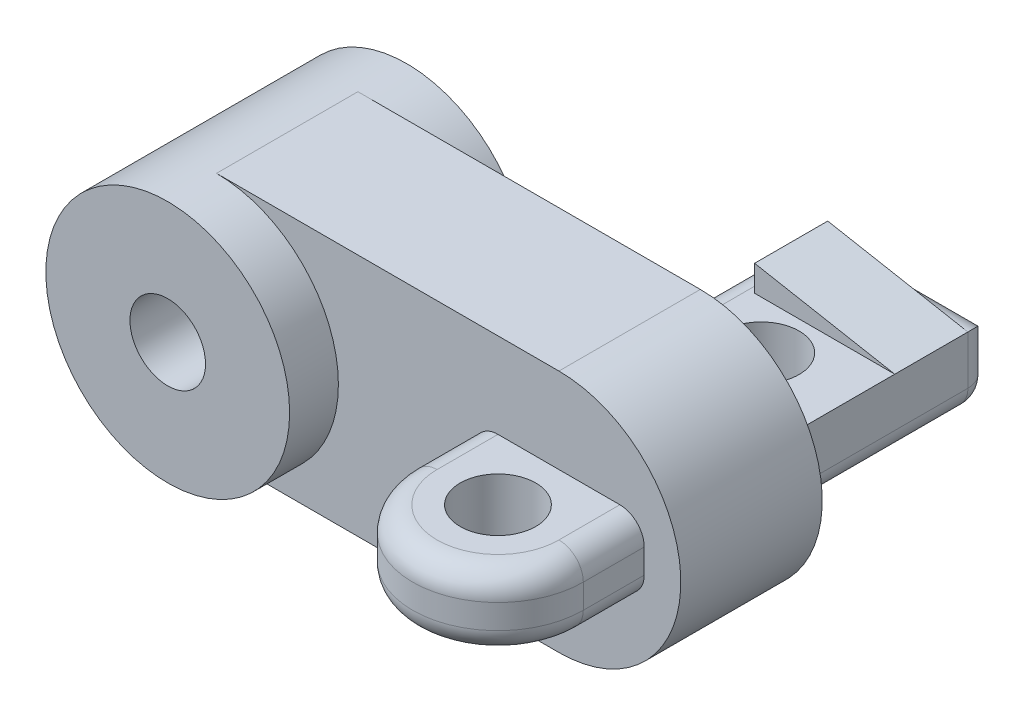
ISO-10303-21;
HEADER;
FILE_DESCRIPTION(('STEP AP214'),'2;1');
FILE_NAME('part.step','',(''),(''),'','','');
FILE_SCHEMA(('AUTOMOTIVE_DESIGN { 1 0 10303 214 1 1 1 1 }'));
ENDSEC;
DATA;
#1=APPLICATION_CONTEXT('core data for automotive mechanical design processes');
#2=APPLICATION_PROTOCOL_DEFINITION('international standard','automotive_design',2000,#1);
#3=PRODUCT_CONTEXT('',#1,'mechanical');
#4=PRODUCT('Part','Part','',(#3));
#5=PRODUCT_RELATED_PRODUCT_CATEGORY('part','',(#4));
#6=PRODUCT_DEFINITION_FORMATION('','',#4);
#7=PRODUCT_DEFINITION_CONTEXT('part definition',#1,'design');
#8=PRODUCT_DEFINITION('design','',#6,#7);
#9=PRODUCT_DEFINITION_SHAPE('','',#8);
#10=(LENGTH_UNIT() NAMED_UNIT(*) SI_UNIT(.MILLI.,.METRE.));
#11=(NAMED_UNIT(*) PLANE_ANGLE_UNIT() SI_UNIT($,.RADIAN.));
#12=(NAMED_UNIT(*) SI_UNIT($,.STERADIAN.) SOLID_ANGLE_UNIT());
#13=UNCERTAINTY_MEASURE_WITH_UNIT(LENGTH_MEASURE(1.E-05),#10,'distance_accuracy_value','');
#14=(GEOMETRIC_REPRESENTATION_CONTEXT(3) GLOBAL_UNCERTAINTY_ASSIGNED_CONTEXT((#13)) GLOBAL_UNIT_ASSIGNED_CONTEXT((#10,
#11,#12)) REPRESENTATION_CONTEXT('',''));
#15=CARTESIAN_POINT('',(0.,0.,0.));
#16=DIRECTION('',(0.,0.,1.));
#17=DIRECTION('',(1.,0.,0.));
#18=AXIS2_PLACEMENT_3D('',#15,#16,#17);
#19=CARTESIAN_POINT('',(14.046192928414,1.5,-0.5));
#20=DIRECTION('',(0.,-1.,0.));
#21=DIRECTION('',(1.,0.,0.));
#22=AXIS2_PLACEMENT_3D('',#19,#20,#21);
#23=PLANE('',#22);
#24=CARTESIAN_POINT('',(14.046192928414,1.5,-0.5));
#25=DIRECTION('',(0.,1.,0.));
#26=DIRECTION('',(-1.,0.,0.));
#27=AXIS2_PLACEMENT_3D('',#24,#25,#26);
#28=CIRCLE('',#27,1.55);
#29=CARTESIAN_POINT('',(12.496192928414,1.5,-0.5));
#30=VERTEX_POINT('',#29);
#31=EDGE_CURVE('E246',#30,#30,#28,.T.);
#32=ORIENTED_EDGE('',*,*,#31,.F.);
#33=EDGE_LOOP('',(#32));
#34=FACE_BOUND('',#33,.T.);
#35=DIRECTION('',(0.,0.,-1.));
#36=VECTOR('',#35,1.);
#37=CARTESIAN_POINT('',(11.796192928414,1.5,-2.4760599038623));
#38=LINE('',#37,#36);
#39=CARTESIAN_POINT('',(11.796192928414,1.5,-2.4760599038623));
#40=VERTEX_POINT('',#39);
#41=CARTESIAN_POINT('',(11.796192928414,1.5,-5.4760599038623));
#42=VERTEX_POINT('',#41);
#43=EDGE_CURVE('E194',#40,#42,#38,.T.);
#44=ORIENTED_EDGE('',*,*,#43,.T.);
#45=DIRECTION('',(-1.,0.,0.));
#46=VECTOR('',#45,1.);
#47=CARTESIAN_POINT('',(10.546192928414,1.5,-5.4760599038623));
#48=LINE('',#47,#46);
#49=CARTESIAN_POINT('',(11.546192928414,1.5,-5.4760599038623));
#50=VERTEX_POINT('',#49);
#51=EDGE_CURVE('E360',#42,#50,#48,.T.);
#52=ORIENTED_EDGE('',*,*,#51,.T.);
#53=DIRECTION('',(0.,0.,1.));
#54=VECTOR('',#53,1.);
#55=CARTESIAN_POINT('',(11.546192928414,1.5,2.));
#56=LINE('',#55,#54);
#57=CARTESIAN_POINT('',(11.546192928414,1.5,2.));
#58=VERTEX_POINT('',#57);
#59=EDGE_CURVE('E348',#50,#58,#56,.T.);
#60=ORIENTED_EDGE('',*,*,#59,.T.);
#61=DIRECTION('',(1.,0.,0.));
#62=VECTOR('',#61,1.);
#63=CARTESIAN_POINT('',(10.546192928414,1.5,2.));
#64=LINE('',#63,#62);
#65=CARTESIAN_POINT('',(17.546192928414,1.5,2.));
#66=VERTEX_POINT('',#65);
#67=EDGE_CURVE('E257',#58,#66,#64,.T.);
#68=ORIENTED_EDGE('',*,*,#67,.T.);
#69=DIRECTION('',(0.,0.,-1.));
#70=VECTOR('',#69,1.);
#71=CARTESIAN_POINT('',(17.546192928414,1.5,2.));
#72=LINE('',#71,#70);
#73=CARTESIAN_POINT('',(17.546192928414,1.5,-2.4760599038623));
#74=VERTEX_POINT('',#73);
#75=EDGE_CURVE('E215',#66,#74,#72,.T.);
#76=ORIENTED_EDGE('',*,*,#75,.T.);
#77=DIRECTION('',(-1.,0.,0.));
#78=VECTOR('',#77,1.);
#79=CARTESIAN_POINT('',(11.796192928414,1.5,-2.4760599038623));
#80=LINE('',#79,#78);
#81=EDGE_CURVE('E209',#74,#40,#80,.T.);
#82=ORIENTED_EDGE('',*,*,#81,.T.);
#83=EDGE_LOOP('',(#44,#52,#60,#68,#76,#82));
#84=FACE_BOUND('',#83,.T.);
#85=ADVANCED_FACE('F35',(#34,#84),#23,.F.);
#86=CARTESIAN_POINT('',(0.,5.,31.3117982759779));
#87=DIRECTION('',(0.,1.,0.));
#88=DIRECTION('',(-1.,0.,0.));
#89=AXIS2_PLACEMENT_3D('',#86,#87,#88);
#90=PLANE('',#89);
#91=DIRECTION('',(0.,0.,-1.));
#92=VECTOR('',#91,1.);
#93=CARTESIAN_POINT('',(0.,5.,31.3117982759779));
#94=LINE('',#93,#92);
#95=CARTESIAN_POINT('',(0.,5.,7.8));
#96=VERTEX_POINT('',#95);
#97=CARTESIAN_POINT('',(0.,5.,2.));
#98=VERTEX_POINT('',#97);
#99=EDGE_CURVE('E297',#96,#98,#94,.T.);
#100=ORIENTED_EDGE('',*,*,#99,.F.);
#101=DIRECTION('',(1.,0.,0.));
#102=VECTOR('',#101,1.);
#103=CARTESIAN_POINT('',(14.046192928414,5.,7.8));
#104=LINE('',#103,#102);
#105=CARTESIAN_POINT('',(14.046192928414,5.,7.8));
#106=VERTEX_POINT('',#105);
#107=EDGE_CURVE('E274',#96,#106,#104,.T.);
#108=ORIENTED_EDGE('',*,*,#107,.T.);
#109=DIRECTION('',(0.,0.,-1.));
#110=VECTOR('',#109,1.);
#111=CARTESIAN_POINT('',(14.046192928414,5.,31.3117982759779));
#112=LINE('',#111,#110);
#113=CARTESIAN_POINT('',(14.046192928414,5.,2.));
#114=VERTEX_POINT('',#113);
#115=EDGE_CURVE('E294',#106,#114,#112,.T.);
#116=ORIENTED_EDGE('',*,*,#115,.T.);
#117=DIRECTION('',(1.,0.,0.));
#118=VECTOR('',#117,1.);
#119=CARTESIAN_POINT('',(7.02309646420698,5.,2.));
#120=LINE('',#119,#118);
#121=EDGE_CURVE('E291',#98,#114,#120,.T.);
#122=ORIENTED_EDGE('',*,*,#121,.F.);
#123=EDGE_LOOP('',(#100,#108,#116,#122));
#124=FACE_BOUND('',#123,.T.);
#125=ADVANCED_FACE('F486',(#124),#90,.T.);
#126=CARTESIAN_POINT('',(14.046192928414,0.,31.3117982759779));
#127=DIRECTION('',(0.,0.,-1.));
#128=DIRECTION('',(-1.,0.,0.));
#129=AXIS2_PLACEMENT_3D('',#126,#127,#128);
#130=CYLINDRICAL_SURFACE('',#129,5.);
#131=ORIENTED_EDGE('',*,*,#115,.F.);
#132=CARTESIAN_POINT('',(14.046192928414,0.,7.8));
#133=DIRECTION('',(0.,0.,-1.));
#134=DIRECTION('',(-1.,0.,0.));
#135=AXIS2_PLACEMENT_3D('',#132,#133,#134);
#136=CIRCLE('',#135,5.);
#137=CARTESIAN_POINT('',(14.046192928414,-5.,7.8));
#138=VERTEX_POINT('',#137);
#139=EDGE_CURVE('E269',#106,#138,#136,.T.);
#140=ORIENTED_EDGE('',*,*,#139,.T.);
#141=DIRECTION('',(0.,0.,-1.));
#142=VECTOR('',#141,1.);
#143=CARTESIAN_POINT('',(14.046192928414,-5.,31.3117982759779));
#144=LINE('',#143,#142);
#145=CARTESIAN_POINT('',(14.046192928414,-5.,2.));
#146=VERTEX_POINT('',#145);
#147=EDGE_CURVE('E298',#138,#146,#144,.T.);
#148=ORIENTED_EDGE('',*,*,#147,.T.);
#149=CARTESIAN_POINT('',(14.046192928414,0.,2.));
#150=DIRECTION('',(0.,0.,-1.));
#151=DIRECTION('',(-1.,0.,0.));
#152=AXIS2_PLACEMENT_3D('',#149,#150,#151);
#153=CIRCLE('',#152,5.);
#154=EDGE_CURVE('E282',#114,#146,#153,.T.);
#155=ORIENTED_EDGE('',*,*,#154,.F.);
#156=EDGE_LOOP('',(#131,#140,#148,#155));
#157=FACE_BOUND('',#156,.T.);
#158=ADVANCED_FACE('F492',(#157),#130,.T.);
#159=CARTESIAN_POINT('',(0.,-5.,31.3117982759779));
#160=DIRECTION('',(0.,-1.,0.));
#161=DIRECTION('',(0.,0.,-1.));
#162=AXIS2_PLACEMENT_3D('',#159,#160,#161);
#163=PLANE('',#162);
#164=ORIENTED_EDGE('',*,*,#147,.F.);
#165=DIRECTION('',(-1.,0.,0.));
#166=VECTOR('',#165,1.);
#167=CARTESIAN_POINT('',(7.02309646420698,-5.,7.8));
#168=LINE('',#167,#166);
#169=CARTESIAN_POINT('',(0.,-5.,7.8));
#170=VERTEX_POINT('',#169);
#171=EDGE_CURVE('E279',#138,#170,#168,.T.);
#172=ORIENTED_EDGE('',*,*,#171,.T.);
#173=DIRECTION('',(0.,0.,-1.));
#174=VECTOR('',#173,1.);
#175=CARTESIAN_POINT('',(0.,-5.,31.3117982759779));
#176=LINE('',#175,#174);
#177=CARTESIAN_POINT('',(0.,-5.,2.));
#178=VERTEX_POINT('',#177);
#179=EDGE_CURVE('E295',#170,#178,#176,.T.);
#180=ORIENTED_EDGE('',*,*,#179,.T.);
#181=DIRECTION('',(-1.,0.,0.));
#182=VECTOR('',#181,1.);
#183=CARTESIAN_POINT('',(7.02309646420698,-5.,2.));
#184=LINE('',#183,#182);
#185=EDGE_CURVE('E285',#146,#178,#184,.T.);
#186=ORIENTED_EDGE('',*,*,#185,.F.);
#187=EDGE_LOOP('',(#164,#172,#180,#186));
#188=FACE_BOUND('',#187,.T.);
#189=ADVANCED_FACE('F518',(#188),#163,.T.);
#190=CARTESIAN_POINT('',(0.,0.,9.8));
#191=DIRECTION('',(0.,0.,1.));
#192=DIRECTION('',(1.,0.,0.));
#193=AXIS2_PLACEMENT_3D('',#190,#191,#192);
#194=PLANE('',#193);
#195=CARTESIAN_POINT('',(0.,0.,9.8));
#196=DIRECTION('',(0.,0.,1.));
#197=DIRECTION('',(1.,0.,0.));
#198=AXIS2_PLACEMENT_3D('',#195,#196,#197);
#199=CIRCLE('',#198,1.55);
#200=CARTESIAN_POINT('',(1.55,0.,9.8));
#201=VERTEX_POINT('',#200);
#202=EDGE_CURVE('E303',#201,#201,#199,.T.);
#203=ORIENTED_EDGE('',*,*,#202,.F.);
#204=EDGE_LOOP('',(#203));
#205=FACE_BOUND('',#204,.T.);
#206=CARTESIAN_POINT('',(0.,0.,9.8));
#207=DIRECTION('',(0.,0.,1.));
#208=DIRECTION('',(1.,0.,0.));
#209=AXIS2_PLACEMENT_3D('',#206,#207,#208);
#210=CIRCLE('',#209,5.);
#211=CARTESIAN_POINT('',(5.,0.,9.8));
#212=VERTEX_POINT('',#211);
#213=EDGE_CURVE('E309',#212,#212,#210,.T.);
#214=ORIENTED_EDGE('',*,*,#213,.T.);
#215=EDGE_LOOP('',(#214));
#216=FACE_BOUND('',#215,.T.);
#217=ADVANCED_FACE('F521',(#205,#216),#194,.T.);
#218=CARTESIAN_POINT('',(0.,0.,0.));
#219=DIRECTION('',(0.,0.,1.));
#220=DIRECTION('',(1.,0.,0.));
#221=AXIS2_PLACEMENT_3D('',#218,#219,#220);
#222=PLANE('',#221);
#223=CARTESIAN_POINT('',(0.,0.,0.));
#224=DIRECTION('',(0.,0.,1.));
#225=DIRECTION('',(1.,0.,0.));
#226=AXIS2_PLACEMENT_3D('',#223,#224,#225);
#227=CIRCLE('',#226,5.);
#228=CARTESIAN_POINT('',(5.,0.,0.));
#229=VERTEX_POINT('',#228);
#230=EDGE_CURVE('E306',#229,#229,#227,.T.);
#231=ORIENTED_EDGE('',*,*,#230,.F.);
#232=EDGE_LOOP('',(#231));
#233=FACE_BOUND('',#232,.T.);
#234=CARTESIAN_POINT('',(0.,0.,0.));
#235=DIRECTION('',(0.,0.,1.));
#236=DIRECTION('',(1.,0.,0.));
#237=AXIS2_PLACEMENT_3D('',#234,#235,#236);
#238=CIRCLE('',#237,1.55);
#239=CARTESIAN_POINT('',(1.55,0.,0.));
#240=VERTEX_POINT('',#239);
#241=EDGE_CURVE('E302',#240,#240,#238,.T.);
#242=ORIENTED_EDGE('',*,*,#241,.T.);
#243=EDGE_LOOP('',(#242));
#244=FACE_BOUND('',#243,.T.);
#245=ADVANCED_FACE('F532',(#233,#244),#222,.F.);
#246=CARTESIAN_POINT('',(0.,0.,9.8));
#247=DIRECTION('',(0.,0.,-1.));
#248=DIRECTION('',(-1.,0.,0.));
#249=AXIS2_PLACEMENT_3D('',#246,#247,#248);
#250=CYLINDRICAL_SURFACE('',#249,5.);
#251=ORIENTED_EDGE('',*,*,#179,.F.);
#252=CARTESIAN_POINT('',(0.,0.,7.8));
#253=DIRECTION('',(0.,0.,1.));
#254=DIRECTION('',(-1.,0.,0.));
#255=AXIS2_PLACEMENT_3D('',#252,#253,#254);
#256=CIRCLE('',#255,5.);
#257=EDGE_CURVE('E277',#170,#96,#256,.T.);
#258=ORIENTED_EDGE('',*,*,#257,.T.);
#259=ORIENTED_EDGE('',*,*,#99,.T.);
#260=CARTESIAN_POINT('',(0.,0.,2.));
#261=DIRECTION('',(0.,0.,1.));
#262=DIRECTION('',(-1.,0.,0.));
#263=AXIS2_PLACEMENT_3D('',#260,#261,#262);
#264=CIRCLE('',#263,5.);
#265=EDGE_CURVE('E288',#178,#98,#264,.T.);
#266=ORIENTED_EDGE('',*,*,#265,.F.);
#267=EDGE_LOOP('',(#251,#258,#259,#266));
#268=FACE_BOUND('',#267,.T.);
#269=ORIENTED_EDGE('',*,*,#230,.T.);
#270=EDGE_LOOP('',(#269));
#271=FACE_BOUND('',#270,.T.);
#272=ORIENTED_EDGE('',*,*,#213,.F.);
#273=EDGE_LOOP('',(#272));
#274=FACE_BOUND('',#273,.T.);
#275=ADVANCED_FACE('F528',(#268,#271,#274),#250,.T.);
#276=CARTESIAN_POINT('',(0.,0.,9.8));
#277=DIRECTION('',(0.,0.,-1.));
#278=DIRECTION('',(-1.,0.,0.));
#279=AXIS2_PLACEMENT_3D('',#276,#277,#278);
#280=CYLINDRICAL_SURFACE('',#279,1.55);
#281=ORIENTED_EDGE('',*,*,#202,.T.);
#282=EDGE_LOOP('',(#281));
#283=FACE_BOUND('',#282,.T.);
#284=ORIENTED_EDGE('',*,*,#241,.F.);
#285=EDGE_LOOP('',(#284));
#286=FACE_BOUND('',#285,.T.);
#287=ADVANCED_FACE('F517',(#283,#286),#280,.F.);
#288=CARTESIAN_POINT('',(14.046192928414,0.,2.));
#289=DIRECTION('',(0.,0.,-1.));
#290=DIRECTION('',(-1.,0.,0.));
#291=AXIS2_PLACEMENT_3D('',#288,#289,#290);
#292=PLANE('',#291);
#293=DIRECTION('',(0.,1.,0.));
#294=VECTOR('',#293,1.);
#295=CARTESIAN_POINT('',(10.546192928414,-1.5,2.));
#296=LINE('',#295,#294);
#297=CARTESIAN_POINT('',(10.546192928414,-0.500000000000001,2.));
#298=VERTEX_POINT('',#297);
#299=CARTESIAN_POINT('',(10.546192928414,0.499999999999999,2.));
#300=VERTEX_POINT('',#299);
#301=EDGE_CURVE('E266',#298,#300,#296,.T.);
#302=ORIENTED_EDGE('',*,*,#301,.F.);
#303=CARTESIAN_POINT('',(11.546192928414,-0.500000000000001,2.));
#304=DIRECTION('',(0.,0.,-1.));
#305=DIRECTION('',(-1.,0.,0.));
#306=AXIS2_PLACEMENT_3D('',#303,#304,#305);
#307=CIRCLE('',#306,1.);
#308=CARTESIAN_POINT('',(11.546192928414,-1.5,2.));
#309=VERTEX_POINT('',#308);
#310=EDGE_CURVE('E44',#298,#309,#307,.F.);
#311=ORIENTED_EDGE('',*,*,#310,.T.);
#312=DIRECTION('',(1.,0.,0.));
#313=VECTOR('',#312,1.);
#314=CARTESIAN_POINT('',(10.546192928414,-1.5,2.));
#315=LINE('',#314,#313);
#316=CARTESIAN_POINT('',(16.546192928414,-1.5,2.));
#317=VERTEX_POINT('',#316);
#318=EDGE_CURVE('E263',#309,#317,#315,.T.);
#319=ORIENTED_EDGE('',*,*,#318,.T.);
#320=CARTESIAN_POINT('',(16.546192928414,-0.500000000000001,2.));
#321=DIRECTION('',(0.,0.,-1.));
#322=DIRECTION('',(-1.,0.,0.));
#323=AXIS2_PLACEMENT_3D('',#320,#321,#322);
#324=CIRCLE('',#323,1.);
#325=CARTESIAN_POINT('',(17.546192928414,-0.500000000000001,2.));
#326=VERTEX_POINT('',#325);
#327=EDGE_CURVE('E11',#317,#326,#324,.F.);
#328=ORIENTED_EDGE('',*,*,#327,.T.);
#329=DIRECTION('',(0.,1.,0.));
#330=VECTOR('',#329,1.);
#331=CARTESIAN_POINT('',(17.546192928414,-1.5,2.));
#332=LINE('',#331,#330);
#333=EDGE_CURVE('E267',#326,#66,#332,.T.);
#334=ORIENTED_EDGE('',*,*,#333,.T.);
#335=ORIENTED_EDGE('',*,*,#67,.F.);
#336=CARTESIAN_POINT('',(11.546192928414,0.499999999999999,2.));
#337=DIRECTION('',(0.,0.,-1.));
#338=DIRECTION('',(-1.,0.,0.));
#339=AXIS2_PLACEMENT_3D('',#336,#337,#338);
#340=CIRCLE('',#339,1.);
#341=EDGE_CURVE('E385',#58,#300,#340,.F.);
#342=ORIENTED_EDGE('',*,*,#341,.T.);
#343=EDGE_LOOP('',(#302,#311,#319,#328,#334,#335,#342));
#344=FACE_BOUND('',#343,.T.);
#345=ORIENTED_EDGE('',*,*,#154,.T.);
#346=ORIENTED_EDGE('',*,*,#185,.T.);
#347=ORIENTED_EDGE('',*,*,#265,.T.);
#348=ORIENTED_EDGE('',*,*,#121,.T.);
#349=EDGE_LOOP('',(#345,#346,#347,#348));
#350=FACE_BOUND('',#349,.T.);
#351=ADVANCED_FACE('F447',(#344,#350),#292,.T.);
#352=CARTESIAN_POINT('',(14.046192928414,0.,7.8));
#353=DIRECTION('',(0.,0.,1.));
#354=DIRECTION('',(-1.,0.,0.));
#355=AXIS2_PLACEMENT_3D('',#352,#353,#354);
#356=PLANE('',#355);
#357=DIRECTION('',(1.,0.,0.));
#358=VECTOR('',#357,1.);
#359=CARTESIAN_POINT('',(10.546192928414,-1.5,7.8));
#360=LINE('',#359,#358);
#361=CARTESIAN_POINT('',(11.546192928414,-1.5,7.8));
#362=VERTEX_POINT('',#361);
#363=CARTESIAN_POINT('',(16.546192928414,-1.5,7.8));
#364=VERTEX_POINT('',#363);
#365=EDGE_CURVE('E239',#362,#364,#360,.T.);
#366=ORIENTED_EDGE('',*,*,#365,.F.);
#367=CARTESIAN_POINT('',(11.546192928414,-0.500000000000001,7.8));
#368=DIRECTION('',(0.,0.,1.));
#369=DIRECTION('',(1.,0.,0.));
#370=AXIS2_PLACEMENT_3D('',#367,#368,#369);
#371=CIRCLE('',#370,1.);
#372=CARTESIAN_POINT('',(10.546192928414,-0.500000000000001,7.8));
#373=VERTEX_POINT('',#372);
#374=EDGE_CURVE('E344',#362,#373,#371,.F.);
#375=ORIENTED_EDGE('',*,*,#374,.T.);
#376=DIRECTION('',(0.,1.,0.));
#377=VECTOR('',#376,1.);
#378=CARTESIAN_POINT('',(10.546192928414,-1.5,7.8));
#379=LINE('',#378,#377);
#380=CARTESIAN_POINT('',(10.546192928414,0.499999999999999,7.8));
#381=VERTEX_POINT('',#380);
#382=EDGE_CURVE('E243',#373,#381,#379,.T.);
#383=ORIENTED_EDGE('',*,*,#382,.T.);
#384=CARTESIAN_POINT('',(11.546192928414,0.499999999999999,7.8));
#385=DIRECTION('',(0.,0.,1.));
#386=DIRECTION('',(1.,0.,0.));
#387=AXIS2_PLACEMENT_3D('',#384,#385,#386);
#388=CIRCLE('',#387,1.);
#389=CARTESIAN_POINT('',(11.546192928414,1.5,7.8));
#390=VERTEX_POINT('',#389);
#391=EDGE_CURVE('E342',#381,#390,#388,.F.);
#392=ORIENTED_EDGE('',*,*,#391,.T.);
#393=DIRECTION('',(1.,0.,0.));
#394=VECTOR('',#393,1.);
#395=CARTESIAN_POINT('',(10.546192928414,1.5,7.8));
#396=LINE('',#395,#394);
#397=CARTESIAN_POINT('',(16.546192928414,1.5,7.8));
#398=VERTEX_POINT('',#397);
#399=EDGE_CURVE('E233',#390,#398,#396,.T.);
#400=ORIENTED_EDGE('',*,*,#399,.T.);
#401=CARTESIAN_POINT('',(16.546192928414,0.499999999999999,7.8));
#402=DIRECTION('',(0.,0.,1.));
#403=DIRECTION('',(1.,0.,0.));
#404=AXIS2_PLACEMENT_3D('',#401,#402,#403);
#405=CIRCLE('',#404,1.);
#406=CARTESIAN_POINT('',(17.546192928414,0.499999999999999,7.8));
#407=VERTEX_POINT('',#406);
#408=EDGE_CURVE('E340',#398,#407,#405,.F.);
#409=ORIENTED_EDGE('',*,*,#408,.T.);
#410=DIRECTION('',(0.,1.,0.));
#411=VECTOR('',#410,1.);
#412=CARTESIAN_POINT('',(17.546192928414,-1.5,7.8));
#413=LINE('',#412,#411);
#414=CARTESIAN_POINT('',(17.546192928414,-0.500000000000001,7.8));
#415=VERTEX_POINT('',#414);
#416=EDGE_CURVE('E247',#415,#407,#413,.T.);
#417=ORIENTED_EDGE('',*,*,#416,.F.);
#418=CARTESIAN_POINT('',(16.546192928414,-0.500000000000001,7.8));
#419=DIRECTION('',(0.,0.,1.));
#420=DIRECTION('',(1.,0.,0.));
#421=AXIS2_PLACEMENT_3D('',#418,#419,#420);
#422=CIRCLE('',#421,1.);
#423=EDGE_CURVE('E346',#415,#364,#422,.F.);
#424=ORIENTED_EDGE('',*,*,#423,.T.);
#425=EDGE_LOOP('',(#366,#375,#383,#392,#400,#409,#417,#424));
#426=FACE_BOUND('',#425,.T.);
#427=ORIENTED_EDGE('',*,*,#139,.F.);
#428=ORIENTED_EDGE('',*,*,#107,.F.);
#429=ORIENTED_EDGE('',*,*,#257,.F.);
#430=ORIENTED_EDGE('',*,*,#171,.F.);
#431=EDGE_LOOP('',(#427,#428,#429,#430));
#432=FACE_BOUND('',#431,.T.);
#433=ADVANCED_FACE('F511',(#426,#432),#356,.T.);
#434=CARTESIAN_POINT('',(10.546192928414,-1.5,2.));
#435=DIRECTION('',(-1.,0.,0.));
#436=DIRECTION('',(0.,-1.,0.));
#437=AXIS2_PLACEMENT_3D('',#434,#435,#436);
#438=PLANE('',#437);
#439=ORIENTED_EDGE('',*,*,#301,.T.);
#440=DIRECTION('',(0.,0.,1.));
#441=VECTOR('',#440,1.);
#442=CARTESIAN_POINT('',(10.546192928414,0.499999999999999,-6.4760599038623));
#443=LINE('',#442,#441);
#444=CARTESIAN_POINT('',(10.546192928414,0.499999999999999,-5.4760599038623));
#445=VERTEX_POINT('',#444);
#446=EDGE_CURVE('E379',#300,#445,#443,.F.);
#447=ORIENTED_EDGE('',*,*,#446,.T.);
#448=DIRECTION('',(0.,1.,0.));
#449=VECTOR('',#448,1.);
#450=CARTESIAN_POINT('',(10.546192928414,-1.5,-5.4760599038623));
#451=LINE('',#450,#449);
#452=CARTESIAN_POINT('',(10.546192928414,-0.500000000000001,-5.4760599038623));
#453=VERTEX_POINT('',#452);
#454=EDGE_CURVE('E377',#445,#453,#451,.F.);
#455=ORIENTED_EDGE('',*,*,#454,.T.);
#456=DIRECTION('',(0.,0.,1.));
#457=VECTOR('',#456,1.);
#458=CARTESIAN_POINT('',(10.546192928414,-0.500000000000001,2.));
#459=LINE('',#458,#457);
#460=EDGE_CURVE('E375',#453,#298,#459,.T.);
#461=ORIENTED_EDGE('',*,*,#460,.T.);
#462=EDGE_LOOP('',(#439,#447,#455,#461));
#463=FACE_BOUND('',#462,.T.);
#464=ADVANCED_FACE('F452',(#463),#438,.T.);
#465=CARTESIAN_POINT('',(17.546192928414,-1.5,2.));
#466=DIRECTION('',(1.,0.,0.));
#467=DIRECTION('',(0.,1.,0.));
#468=AXIS2_PLACEMENT_3D('',#465,#466,#467);
#469=PLANE('',#468);
#470=DIRECTION('',(0.,0.,-1.));
#471=VECTOR('',#470,1.);
#472=CARTESIAN_POINT('',(17.546192928414,-0.500000000000001,2.));
#473=LINE('',#472,#471);
#474=CARTESIAN_POINT('',(17.546192928414,-0.500000000000001,-5.4760599038623));
#475=VERTEX_POINT('',#474);
#476=EDGE_CURVE('E371',#326,#475,#473,.T.);
#477=ORIENTED_EDGE('',*,*,#476,.T.);
#478=DIRECTION('',(0.,1.,0.));
#479=VECTOR('',#478,1.);
#480=CARTESIAN_POINT('',(17.546192928414,-1.5,-5.4760599038623));
#481=LINE('',#480,#479);
#482=CARTESIAN_POINT('',(17.546192928414,1.5,-5.4760599038623));
#483=VERTEX_POINT('',#482);
#484=EDGE_CURVE('E373',#475,#483,#481,.T.);
#485=ORIENTED_EDGE('',*,*,#484,.T.);
#486=DIRECTION('',(0.,0.,-1.));
#487=VECTOR('',#486,1.);
#488=CARTESIAN_POINT('',(17.546192928414,1.5,-2.4760599038623));
#489=LINE('',#488,#487);
#490=EDGE_CURVE('E226',#74,#483,#489,.T.);
#491=ORIENTED_EDGE('',*,*,#490,.F.);
#492=ORIENTED_EDGE('',*,*,#75,.F.);
#493=ORIENTED_EDGE('',*,*,#333,.F.);
#494=EDGE_LOOP('',(#477,#485,#491,#492,#493));
#495=FACE_BOUND('',#494,.T.);
#496=ADVANCED_FACE('F469',(#495),#469,.T.);
#497=CARTESIAN_POINT('',(14.046192928414,-1.5,-0.5));
#498=DIRECTION('',(0.,-1.,0.));
#499=DIRECTION('',(1.,0.,0.));
#500=AXIS2_PLACEMENT_3D('',#497,#498,#499);
#501=PLANE('',#500);
#502=ORIENTED_EDGE('',*,*,#318,.F.);
#503=DIRECTION('',(0.,0.,1.));
#504=VECTOR('',#503,1.);
#505=CARTESIAN_POINT('',(11.546192928414,-1.5,-0.5));
#506=LINE('',#505,#504);
#507=CARTESIAN_POINT('',(11.546192928414,-1.5,-5.4760599038623));
#508=VERTEX_POINT('',#507);
#509=EDGE_CURVE('E57',#309,#508,#506,.F.);
#510=ORIENTED_EDGE('',*,*,#509,.T.);
#511=DIRECTION('',(-1.,0.,0.));
#512=VECTOR('',#511,1.);
#513=CARTESIAN_POINT('',(14.046192928414,-1.5,-5.4760599038623));
#514=LINE('',#513,#512);
#515=CARTESIAN_POINT('',(16.546192928414,-1.5,-5.4760599038623));
#516=VERTEX_POINT('',#515);
#517=EDGE_CURVE('E52',#508,#516,#514,.F.);
#518=ORIENTED_EDGE('',*,*,#517,.T.);
#519=DIRECTION('',(0.,0.,-1.));
#520=VECTOR('',#519,1.);
#521=CARTESIAN_POINT('',(16.546192928414,-1.5,-0.5));
#522=LINE('',#521,#520);
#523=EDGE_CURVE('E382',#516,#317,#522,.F.);
#524=ORIENTED_EDGE('',*,*,#523,.T.);
#525=EDGE_LOOP('',(#502,#510,#518,#524));
#526=FACE_BOUND('',#525,.T.);
#527=CARTESIAN_POINT('',(14.046192928414,-1.5,-0.5));
#528=DIRECTION('',(0.,1.,0.));
#529=DIRECTION('',(-1.,0.,0.));
#530=AXIS2_PLACEMENT_3D('',#527,#528,#529);
#531=CIRCLE('',#530,1.55);
#532=CARTESIAN_POINT('',(12.496192928414,-1.5,-0.5));
#533=VERTEX_POINT('',#532);
#534=EDGE_CURVE('E260',#533,#533,#531,.T.);
#535=ORIENTED_EDGE('',*,*,#534,.T.);
#536=EDGE_LOOP('',(#535));
#537=FACE_BOUND('',#536,.T.);
#538=ADVANCED_FACE('F443',(#526,#537),#501,.T.);
#539=CARTESIAN_POINT('',(14.046192928414,-1.5,-0.5));
#540=DIRECTION('',(0.,1.,0.));
#541=DIRECTION('',(-1.,0.,0.));
#542=AXIS2_PLACEMENT_3D('',#539,#540,#541);
#543=CYLINDRICAL_SURFACE('',#542,1.55);
#544=ORIENTED_EDGE('',*,*,#534,.F.);
#545=EDGE_LOOP('',(#544));
#546=FACE_BOUND('',#545,.T.);
#547=ORIENTED_EDGE('',*,*,#31,.T.);
#548=EDGE_LOOP('',(#547));
#549=FACE_BOUND('',#548,.T.);
#550=ADVANCED_FACE('F500',(#546,#549),#543,.F.);
#551=CARTESIAN_POINT('',(14.046192928414,-1.5,10.3));
#552=DIRECTION('',(0.,-1.,0.));
#553=DIRECTION('',(1.,0.,0.));
#554=AXIS2_PLACEMENT_3D('',#551,#552,#553);
#555=PLANE('',#554);
#556=CARTESIAN_POINT('',(14.046192928414,-1.5,10.3));
#557=DIRECTION('',(0.,-1.,0.));
#558=DIRECTION('',(1.,0.,0.));
#559=AXIS2_PLACEMENT_3D('',#556,#557,#558);
#560=CIRCLE('',#559,2.5);
#561=CARTESIAN_POINT('',(16.546192928414,-1.5,10.3));
#562=VERTEX_POINT('',#561);
#563=CARTESIAN_POINT('',(11.546192928414,-1.5,10.3));
#564=VERTEX_POINT('',#563);
#565=EDGE_CURVE('E331',#562,#564,#560,.T.);
#566=ORIENTED_EDGE('',*,*,#565,.T.);
#567=DIRECTION('',(0.,0.,-1.));
#568=VECTOR('',#567,1.);
#569=CARTESIAN_POINT('',(11.546192928414,-1.5,7.8));
#570=LINE('',#569,#568);
#571=EDGE_CURVE('E333',#564,#362,#570,.T.);
#572=ORIENTED_EDGE('',*,*,#571,.T.);
#573=ORIENTED_EDGE('',*,*,#365,.T.);
#574=DIRECTION('',(0.,0.,1.));
#575=VECTOR('',#574,1.);
#576=CARTESIAN_POINT('',(16.546192928414,-1.5,10.3));
#577=LINE('',#576,#575);
#578=EDGE_CURVE('E329',#364,#562,#577,.T.);
#579=ORIENTED_EDGE('',*,*,#578,.T.);
#580=EDGE_LOOP('',(#566,#572,#573,#579));
#581=FACE_BOUND('',#580,.T.);
#582=CARTESIAN_POINT('',(14.046192928414,-1.5,10.3));
#583=DIRECTION('',(0.,-1.,0.));
#584=DIRECTION('',(-1.,0.,0.));
#585=AXIS2_PLACEMENT_3D('',#582,#583,#584);
#586=CIRCLE('',#585,1.55);
#587=CARTESIAN_POINT('',(12.496192928414,-1.5,10.3));
#588=VERTEX_POINT('',#587);
#589=EDGE_CURVE('E236',#588,#588,#586,.T.);
#590=ORIENTED_EDGE('',*,*,#589,.F.);
#591=EDGE_LOOP('',(#590));
#592=FACE_BOUND('',#591,.T.);
#593=ADVANCED_FACE('F503',(#581,#592),#555,.T.);
#594=CARTESIAN_POINT('',(10.546192928414,-1.5,7.8));
#595=DIRECTION('',(1.,0.,0.));
#596=DIRECTION('',(0.,1.,0.));
#597=AXIS2_PLACEMENT_3D('',#594,#595,#596);
#598=PLANE('',#597);
#599=DIRECTION('',(0.,1.,0.));
#600=VECTOR('',#599,1.);
#601=CARTESIAN_POINT('',(10.546192928414,-1.5,10.3));
#602=LINE('',#601,#600);
#603=CARTESIAN_POINT('',(10.546192928414,-0.500000000000001,10.3));
#604=VERTEX_POINT('',#603);
#605=CARTESIAN_POINT('',(10.546192928414,0.499999999999999,10.3));
#606=VERTEX_POINT('',#605);
#607=EDGE_CURVE('E242',#604,#606,#602,.T.);
#608=ORIENTED_EDGE('',*,*,#607,.T.);
#609=DIRECTION('',(0.,0.,-1.));
#610=VECTOR('',#609,1.);
#611=CARTESIAN_POINT('',(10.546192928414,0.499999999999999,7.8));
#612=LINE('',#611,#610);
#613=EDGE_CURVE('E327',#606,#381,#612,.T.);
#614=ORIENTED_EDGE('',*,*,#613,.T.);
#615=ORIENTED_EDGE('',*,*,#382,.F.);
#616=DIRECTION('',(0.,0.,-1.));
#617=VECTOR('',#616,1.);
#618=CARTESIAN_POINT('',(10.546192928414,-0.500000000000001,10.3));
#619=LINE('',#618,#617);
#620=EDGE_CURVE('E325',#373,#604,#619,.F.);
#621=ORIENTED_EDGE('',*,*,#620,.T.);
#622=EDGE_LOOP('',(#608,#614,#615,#621));
#623=FACE_BOUND('',#622,.T.);
#624=ADVANCED_FACE('F498',(#623),#598,.F.);
#625=CARTESIAN_POINT('',(17.546192928414,-1.5,7.8));
#626=DIRECTION('',(-1.,0.,0.));
#627=DIRECTION('',(0.,-1.,0.));
#628=AXIS2_PLACEMENT_3D('',#625,#626,#627);
#629=PLANE('',#628);
#630=ORIENTED_EDGE('',*,*,#416,.T.);
#631=DIRECTION('',(0.,0.,1.));
#632=VECTOR('',#631,1.);
#633=CARTESIAN_POINT('',(17.546192928414,0.499999999999999,7.8));
#634=LINE('',#633,#632);
#635=CARTESIAN_POINT('',(17.546192928414,0.499999999999999,10.3));
#636=VERTEX_POINT('',#635);
#637=EDGE_CURVE('E316',#407,#636,#634,.T.);
#638=ORIENTED_EDGE('',*,*,#637,.T.);
#639=DIRECTION('',(0.,1.,0.));
#640=VECTOR('',#639,1.);
#641=CARTESIAN_POINT('',(17.546192928414,-1.5,10.3));
#642=LINE('',#641,#640);
#643=CARTESIAN_POINT('',(17.546192928414,-0.500000000000001,10.3));
#644=VERTEX_POINT('',#643);
#645=EDGE_CURVE('E250',#644,#636,#642,.T.);
#646=ORIENTED_EDGE('',*,*,#645,.F.);
#647=DIRECTION('',(0.,0.,1.));
#648=VECTOR('',#647,1.);
#649=CARTESIAN_POINT('',(17.546192928414,-0.500000000000001,7.8));
#650=LINE('',#649,#648);
#651=EDGE_CURVE('E312',#644,#415,#650,.F.);
#652=ORIENTED_EDGE('',*,*,#651,.T.);
#653=EDGE_LOOP('',(#630,#638,#646,#652));
#654=FACE_BOUND('',#653,.T.);
#655=ADVANCED_FACE('F702',(#654),#629,.F.);
#656=CARTESIAN_POINT('',(14.046192928414,-1.5,10.3));
#657=DIRECTION('',(0.,1.,0.));
#658=DIRECTION('',(-1.,0.,0.));
#659=AXIS2_PLACEMENT_3D('',#656,#657,#658);
#660=CYLINDRICAL_SURFACE('',#659,3.5);
#661=ORIENTED_EDGE('',*,*,#607,.F.);
#662=CARTESIAN_POINT('',(14.046192928414,-0.500000000000001,10.3));
#663=DIRECTION('',(0.,-1.,0.));
#664=DIRECTION('',(1.,0.,0.));
#665=AXIS2_PLACEMENT_3D('',#662,#663,#664);
#666=CIRCLE('',#665,3.5);
#667=EDGE_CURVE('E338',#604,#644,#666,.F.);
#668=ORIENTED_EDGE('',*,*,#667,.T.);
#669=ORIENTED_EDGE('',*,*,#645,.T.);
#670=CARTESIAN_POINT('',(14.046192928414,0.499999999999999,10.3));
#671=DIRECTION('',(0.,-1.,0.));
#672=DIRECTION('',(1.,0.,0.));
#673=AXIS2_PLACEMENT_3D('',#670,#671,#672);
#674=CIRCLE('',#673,3.5);
#675=EDGE_CURVE('E336',#636,#606,#674,.T.);
#676=ORIENTED_EDGE('',*,*,#675,.T.);
#677=EDGE_LOOP('',(#661,#668,#669,#676));
#678=FACE_BOUND('',#677,.T.);
#679=ADVANCED_FACE('F711',(#678),#660,.T.);
#680=CARTESIAN_POINT('',(14.046192928414,-1.5,10.3));
#681=DIRECTION('',(0.,1.,0.));
#682=DIRECTION('',(-1.,0.,0.));
#683=AXIS2_PLACEMENT_3D('',#680,#681,#682);
#684=CYLINDRICAL_SURFACE('',#683,1.55);
#685=ORIENTED_EDGE('',*,*,#589,.T.);
#686=EDGE_LOOP('',(#685));
#687=FACE_BOUND('',#686,.T.);
#688=CARTESIAN_POINT('',(14.046192928414,1.5,10.3));
#689=DIRECTION('',(0.,-1.,0.));
#690=DIRECTION('',(-1.,0.,0.));
#691=AXIS2_PLACEMENT_3D('',#688,#689,#690);
#692=CIRCLE('',#691,1.55);
#693=CARTESIAN_POINT('',(12.496192928414,1.5,10.3));
#694=VERTEX_POINT('',#693);
#695=EDGE_CURVE('E229',#694,#694,#692,.T.);
#696=ORIENTED_EDGE('',*,*,#695,.F.);
#697=EDGE_LOOP('',(#696));
#698=FACE_BOUND('',#697,.T.);
#699=ADVANCED_FACE('F720',(#687,#698),#684,.F.);
#700=CARTESIAN_POINT('',(14.046192928414,1.5,10.3));
#701=DIRECTION('',(0.,-1.,0.));
#702=DIRECTION('',(1.,0.,0.));
#703=AXIS2_PLACEMENT_3D('',#700,#701,#702);
#704=PLANE('',#703);
#705=ORIENTED_EDGE('',*,*,#695,.T.);
#706=EDGE_LOOP('',(#705));
#707=FACE_BOUND('',#706,.T.);
#708=CARTESIAN_POINT('',(14.046192928414,1.5,10.3));
#709=DIRECTION('',(0.,-1.,0.));
#710=DIRECTION('',(1.,0.,0.));
#711=AXIS2_PLACEMENT_3D('',#708,#709,#710);
#712=CIRCLE('',#711,2.5);
#713=CARTESIAN_POINT('',(11.546192928414,1.5,10.3));
#714=VERTEX_POINT('',#713);
#715=CARTESIAN_POINT('',(16.546192928414,1.5,10.3));
#716=VERTEX_POINT('',#715);
#717=EDGE_CURVE('E319',#714,#716,#712,.F.);
#718=ORIENTED_EDGE('',*,*,#717,.T.);
#719=DIRECTION('',(0.,0.,1.));
#720=VECTOR('',#719,1.);
#721=CARTESIAN_POINT('',(16.546192928414,1.5,10.3));
#722=LINE('',#721,#720);
#723=EDGE_CURVE('E323',#716,#398,#722,.F.);
#724=ORIENTED_EDGE('',*,*,#723,.T.);
#725=ORIENTED_EDGE('',*,*,#399,.F.);
#726=DIRECTION('',(0.,0.,-1.));
#727=VECTOR('',#726,1.);
#728=CARTESIAN_POINT('',(11.546192928414,1.5,10.3));
#729=LINE('',#728,#727);
#730=EDGE_CURVE('E321',#390,#714,#729,.F.);
#731=ORIENTED_EDGE('',*,*,#730,.T.);
#732=EDGE_LOOP('',(#718,#724,#725,#731));
#733=FACE_BOUND('',#732,.T.);
#734=ADVANCED_FACE('F482',(#707,#733),#704,.F.);
#735=CARTESIAN_POINT('',(10.546192928414,-10.7039823975576,-6.4760599038623));
#736=DIRECTION('',(0.,0.,-1.));
#737=DIRECTION('',(-1.,0.,0.));
#738=AXIS2_PLACEMENT_3D('',#735,#736,#737);
#739=PLANE('',#738);
#740=DIRECTION('',(0.,1.,0.));
#741=VECTOR('',#740,1.);
#742=CARTESIAN_POINT('',(11.546192928414,-10.7039823975576,-6.4760599038623));
#743=LINE('',#742,#741);
#744=CARTESIAN_POINT('',(11.546192928414,-0.500000000000001,-6.4760599038623));
#745=VERTEX_POINT('',#744);
#746=CARTESIAN_POINT('',(11.546192928414,0.499999999999999,-6.4760599038623));
#747=VERTEX_POINT('',#746);
#748=EDGE_CURVE('E364',#745,#747,#743,.T.);
#749=ORIENTED_EDGE('',*,*,#748,.T.);
#750=DIRECTION('',(-1.,0.,0.));
#751=VECTOR('',#750,1.);
#752=CARTESIAN_POINT('',(17.546192928414,0.499999999999999,-6.4760599038623));
#753=LINE('',#752,#751);
#754=CARTESIAN_POINT('',(16.546192928414,0.499999999999999,-6.4760599038623));
#755=VERTEX_POINT('',#754);
#756=EDGE_CURVE('E368',#747,#755,#753,.F.);
#757=ORIENTED_EDGE('',*,*,#756,.T.);
#758=DIRECTION('',(0.,1.,0.));
#759=VECTOR('',#758,1.);
#760=CARTESIAN_POINT('',(16.546192928414,-10.7039823975576,-6.4760599038623));
#761=LINE('',#760,#759);
#762=CARTESIAN_POINT('',(16.546192928414,-0.500000000000001,-6.4760599038623));
#763=VERTEX_POINT('',#762);
#764=EDGE_CURVE('E366',#755,#763,#761,.F.);
#765=ORIENTED_EDGE('',*,*,#764,.T.);
#766=DIRECTION('',(-1.,0.,0.));
#767=VECTOR('',#766,1.);
#768=CARTESIAN_POINT('',(10.546192928414,-0.5,-6.4760599038623));
#769=LINE('',#768,#767);
#770=EDGE_CURVE('E362',#763,#745,#769,.T.);
#771=ORIENTED_EDGE('',*,*,#770,.T.);
#772=EDGE_LOOP('',(#749,#757,#765,#771));
#773=FACE_BOUND('',#772,.T.);
#774=ADVANCED_FACE('F428',(#773),#739,.T.);
#775=CARTESIAN_POINT('',(17.546192928414,1.5,-2.4760599038623));
#776=DIRECTION('',(0.182235525492141,0.983254907563956,0.));
#777=DIRECTION('',(-0.983254907563956,0.182235525492141,0.));
#778=AXIS2_PLACEMENT_3D('',#775,#776,#777);
#779=PLANE('',#778);
#780=DIRECTION('',(0.983254907563956,-0.182235525492141,0.));
#781=VECTOR('',#780,1.);
#782=CARTESIAN_POINT('',(17.546192928414,1.5,-5.4760599038623));
#783=LINE('',#782,#781);
#784=CARTESIAN_POINT('',(11.796192928414,2.56569950835628,-5.4760599038623));
#785=VERTEX_POINT('',#784);
#786=EDGE_CURVE('E216',#785,#483,#783,.T.);
#787=ORIENTED_EDGE('',*,*,#786,.F.);
#788=DIRECTION('',(0.,0.,-1.));
#789=VECTOR('',#788,1.);
#790=CARTESIAN_POINT('',(11.796192928414,2.56569950835628,-2.4760599038623));
#791=LINE('',#790,#789);
#792=CARTESIAN_POINT('',(11.796192928414,2.56569950835628,-2.4760599038623));
#793=VERTEX_POINT('',#792);
#794=EDGE_CURVE('E204',#793,#785,#791,.T.);
#795=ORIENTED_EDGE('',*,*,#794,.F.);
#796=DIRECTION('',(0.983254907563956,-0.182235525492141,0.));
#797=VECTOR('',#796,1.);
#798=CARTESIAN_POINT('',(17.546192928414,1.5,-2.4760599038623));
#799=LINE('',#798,#797);
#800=EDGE_CURVE('E205',#793,#74,#799,.T.);
#801=ORIENTED_EDGE('',*,*,#800,.T.);
#802=ORIENTED_EDGE('',*,*,#490,.T.);
#803=EDGE_LOOP('',(#787,#795,#801,#802));
#804=FACE_BOUND('',#803,.T.);
#805=ADVANCED_FACE('F474',(#804),#779,.T.);
#806=CARTESIAN_POINT('',(11.796192928414,2.56569950835628,-2.4760599038623));
#807=DIRECTION('',(-1.,0.,0.));
#808=DIRECTION('',(0.,0.,1.));
#809=AXIS2_PLACEMENT_3D('',#806,#807,#808);
#810=PLANE('',#809);
#811=DIRECTION('',(0.,1.,0.));
#812=VECTOR('',#811,1.);
#813=CARTESIAN_POINT('',(11.796192928414,2.56569950835628,-5.4760599038623));
#814=LINE('',#813,#812);
#815=EDGE_CURVE('E200',#42,#785,#814,.T.);
#816=ORIENTED_EDGE('',*,*,#815,.F.);
#817=ORIENTED_EDGE('',*,*,#43,.F.);
#818=DIRECTION('',(0.,1.,0.));
#819=VECTOR('',#818,1.);
#820=CARTESIAN_POINT('',(11.796192928414,2.56569950835628,-2.4760599038623));
#821=LINE('',#820,#819);
#822=EDGE_CURVE('E197',#40,#793,#821,.T.);
#823=ORIENTED_EDGE('',*,*,#822,.T.);
#824=ORIENTED_EDGE('',*,*,#794,.T.);
#825=EDGE_LOOP('',(#816,#817,#823,#824));
#826=FACE_BOUND('',#825,.T.);
#827=ADVANCED_FACE('F196',(#826),#810,.T.);
#828=CARTESIAN_POINT('',(0.,0.,-2.4760599038623));
#829=DIRECTION('',(0.,0.,-1.));
#830=DIRECTION('',(-1.,0.,0.));
#831=AXIS2_PLACEMENT_3D('',#828,#829,#830);
#832=PLANE('',#831);
#833=ORIENTED_EDGE('',*,*,#81,.F.);
#834=ORIENTED_EDGE('',*,*,#800,.F.);
#835=ORIENTED_EDGE('',*,*,#822,.F.);
#836=EDGE_LOOP('',(#833,#834,#835));
#837=FACE_BOUND('',#836,.T.);
#838=ADVANCED_FACE('F208',(#837),#832,.F.);
#839=CARTESIAN_POINT('',(0.,0.,-5.4760599038623));
#840=DIRECTION('',(0.,0.,-1.));
#841=DIRECTION('',(-1.,0.,0.));
#842=AXIS2_PLACEMENT_3D('',#839,#840,#841);
#843=PLANE('',#842);
#844=DIRECTION('',(-1.,0.,0.));
#845=VECTOR('',#844,1.);
#846=CARTESIAN_POINT('',(11.796192928414,1.5,-5.4760599038623));
#847=LINE('',#846,#845);
#848=EDGE_CURVE('E222',#483,#42,#847,.T.);
#849=ORIENTED_EDGE('',*,*,#848,.T.);
#850=ORIENTED_EDGE('',*,*,#815,.T.);
#851=ORIENTED_EDGE('',*,*,#786,.T.);
#852=EDGE_LOOP('',(#849,#850,#851));
#853=FACE_BOUND('',#852,.T.);
#854=ADVANCED_FACE('F472',(#853),#843,.T.);
#855=CARTESIAN_POINT('',(11.546192928414,0.499999999999999,7.8));
#856=DIRECTION('',(0.,0.,-1.));
#857=DIRECTION('',(-1.,0.,0.));
#858=AXIS2_PLACEMENT_3D('',#855,#856,#857);
#859=CYLINDRICAL_SURFACE('',#858,1.);
#860=ORIENTED_EDGE('',*,*,#391,.F.);
#861=ORIENTED_EDGE('',*,*,#613,.F.);
#862=CARTESIAN_POINT('',(11.546192928414,0.499999999999999,10.3));
#863=DIRECTION('',(0.,0.,1.));
#864=DIRECTION('',(1.,0.,0.));
#865=AXIS2_PLACEMENT_3D('',#862,#863,#864);
#866=CIRCLE('',#865,1.);
#867=EDGE_CURVE('E224',#714,#606,#866,.T.);
#868=ORIENTED_EDGE('',*,*,#867,.F.);
#869=ORIENTED_EDGE('',*,*,#730,.F.);
#870=EDGE_LOOP('',(#860,#861,#868,#869));
#871=FACE_BOUND('',#870,.T.);
#872=ADVANCED_FACE('F548',(#871),#859,.T.);
#873=CARTESIAN_POINT('',(14.046192928414,0.499999999999999,10.3));
#874=DIRECTION('',(0.,-1.,0.));
#875=DIRECTION('',(1.,0.,0.));
#876=AXIS2_PLACEMENT_3D('',#873,#874,#875);
#877=TOROIDAL_SURFACE('',#876,2.5,1.);
#878=ORIENTED_EDGE('',*,*,#867,.T.);
#879=ORIENTED_EDGE('',*,*,#675,.F.);
#880=CARTESIAN_POINT('',(16.546192928414,0.499999999999999,10.3));
#881=DIRECTION('',(0.,0.,-1.));
#882=DIRECTION('',(-1.,0.,0.));
#883=AXIS2_PLACEMENT_3D('',#880,#881,#882);
#884=CIRCLE('',#883,1.);
#885=EDGE_CURVE('E349',#716,#636,#884,.T.);
#886=ORIENTED_EDGE('',*,*,#885,.F.);
#887=ORIENTED_EDGE('',*,*,#717,.F.);
#888=EDGE_LOOP('',(#878,#879,#886,#887));
#889=FACE_BOUND('',#888,.T.);
#890=ADVANCED_FACE('F544',(#889),#877,.T.);
#891=CARTESIAN_POINT('',(16.546192928414,0.499999999999999,7.8));
#892=DIRECTION('',(0.,0.,1.));
#893=DIRECTION('',(1.,0.,0.));
#894=AXIS2_PLACEMENT_3D('',#891,#892,#893);
#895=CYLINDRICAL_SURFACE('',#894,1.);
#896=ORIENTED_EDGE('',*,*,#408,.F.);
#897=ORIENTED_EDGE('',*,*,#723,.F.);
#898=ORIENTED_EDGE('',*,*,#885,.T.);
#899=ORIENTED_EDGE('',*,*,#637,.F.);
#900=EDGE_LOOP('',(#896,#897,#898,#899));
#901=FACE_BOUND('',#900,.T.);
#902=ADVANCED_FACE('F540',(#901),#895,.T.);
#903=CARTESIAN_POINT('',(16.546192928414,-0.500000000000001,10.3));
#904=DIRECTION('',(0.,0.,-1.));
#905=DIRECTION('',(-1.,0.,0.));
#906=AXIS2_PLACEMENT_3D('',#903,#904,#905);
#907=CYLINDRICAL_SURFACE('',#906,1.);
#908=ORIENTED_EDGE('',*,*,#423,.F.);
#909=ORIENTED_EDGE('',*,*,#651,.F.);
#910=CARTESIAN_POINT('',(16.546192928414,-0.500000000000001,10.3));
#911=DIRECTION('',(0.,0.,1.));
#912=DIRECTION('',(1.,0.,0.));
#913=AXIS2_PLACEMENT_3D('',#910,#911,#912);
#914=CIRCLE('',#913,1.);
#915=EDGE_CURVE('E351',#562,#644,#914,.T.);
#916=ORIENTED_EDGE('',*,*,#915,.F.);
#917=ORIENTED_EDGE('',*,*,#578,.F.);
#918=EDGE_LOOP('',(#908,#909,#916,#917));
#919=FACE_BOUND('',#918,.T.);
#920=ADVANCED_FACE('F543',(#919),#907,.T.);
#921=CARTESIAN_POINT('',(14.046192928414,-0.500000000000001,10.3));
#922=DIRECTION('',(0.,-1.,0.));
#923=DIRECTION('',(1.,0.,0.));
#924=AXIS2_PLACEMENT_3D('',#921,#922,#923);
#925=TOROIDAL_SURFACE('',#924,2.5,1.);
#926=ORIENTED_EDGE('',*,*,#915,.T.);
#927=ORIENTED_EDGE('',*,*,#667,.F.);
#928=CARTESIAN_POINT('',(11.546192928414,-0.500000000000001,10.3));
#929=DIRECTION('',(0.,0.,-1.));
#930=DIRECTION('',(-1.,0.,0.));
#931=AXIS2_PLACEMENT_3D('',#928,#929,#930);
#932=CIRCLE('',#931,1.);
#933=EDGE_CURVE('E354',#564,#604,#932,.T.);
#934=ORIENTED_EDGE('',*,*,#933,.F.);
#935=ORIENTED_EDGE('',*,*,#565,.F.);
#936=EDGE_LOOP('',(#926,#927,#934,#935));
#937=FACE_BOUND('',#936,.T.);
#938=ADVANCED_FACE('F556',(#937),#925,.T.);
#939=CARTESIAN_POINT('',(11.546192928414,-0.500000000000001,10.3));
#940=DIRECTION('',(0.,0.,1.));
#941=DIRECTION('',(1.,0.,0.));
#942=AXIS2_PLACEMENT_3D('',#939,#940,#941);
#943=CYLINDRICAL_SURFACE('',#942,1.);
#944=ORIENTED_EDGE('',*,*,#933,.T.);
#945=ORIENTED_EDGE('',*,*,#620,.F.);
#946=ORIENTED_EDGE('',*,*,#374,.F.);
#947=ORIENTED_EDGE('',*,*,#571,.F.);
#948=EDGE_LOOP('',(#944,#945,#946,#947));
#949=FACE_BOUND('',#948,.T.);
#950=ADVANCED_FACE('F553',(#949),#943,.T.);
#951=CARTESIAN_POINT('',(11.546192928414,-0.500000000000001,2.));
#952=DIRECTION('',(0.,0.,1.));
#953=DIRECTION('',(1.,0.,0.));
#954=AXIS2_PLACEMENT_3D('',#951,#952,#953);
#955=CYLINDRICAL_SURFACE('',#954,1.);
#956=ORIENTED_EDGE('',*,*,#310,.F.);
#957=ORIENTED_EDGE('',*,*,#460,.F.);
#958=CARTESIAN_POINT('',(11.546192928414,-0.500000000000001,-5.4760599038623));
#959=DIRECTION('',(0.,0.,-1.));
#960=DIRECTION('',(-1.,0.,0.));
#961=AXIS2_PLACEMENT_3D('',#958,#959,#960);
#962=CIRCLE('',#961,1.);
#963=EDGE_CURVE('E39',#508,#453,#962,.T.);
#964=ORIENTED_EDGE('',*,*,#963,.F.);
#965=ORIENTED_EDGE('',*,*,#509,.F.);
#966=EDGE_LOOP('',(#956,#957,#964,#965));
#967=FACE_BOUND('',#966,.T.);
#968=ADVANCED_FACE('F37',(#967),#955,.T.);
#969=CARTESIAN_POINT('',(10.546192928414,-0.5,-5.4760599038623));
#970=DIRECTION('',(-1.,0.,0.));
#971=DIRECTION('',(0.,-1.,0.));
#972=AXIS2_PLACEMENT_3D('',#969,#970,#971);
#973=CYLINDRICAL_SURFACE('',#972,1.);
#974=CARTESIAN_POINT('',(16.546192928414,-0.500000000000001,-5.4760599038623));
#975=DIRECTION('',(1.,0.,0.));
#976=DIRECTION('',(0.,0.,-1.));
#977=AXIS2_PLACEMENT_3D('',#974,#975,#976);
#978=CIRCLE('',#977,1.);
#979=EDGE_CURVE('E408',#516,#763,#978,.T.);
#980=ORIENTED_EDGE('',*,*,#979,.F.);
#981=ORIENTED_EDGE('',*,*,#517,.F.);
#982=CARTESIAN_POINT('',(11.546192928414,-0.500000000000001,-5.4760599038623));
#983=DIRECTION('',(-1.,0.,0.));
#984=DIRECTION('',(0.,0.,1.));
#985=AXIS2_PLACEMENT_3D('',#982,#983,#984);
#986=CIRCLE('',#985,1.);
#987=EDGE_CURVE('E410',#745,#508,#986,.T.);
#988=ORIENTED_EDGE('',*,*,#987,.F.);
#989=ORIENTED_EDGE('',*,*,#770,.F.);
#990=EDGE_LOOP('',(#980,#981,#988,#989));
#991=FACE_BOUND('',#990,.T.);
#992=ADVANCED_FACE('F433',(#991),#973,.T.);
#993=CARTESIAN_POINT('',(16.546192928414,-0.500000000000001,2.));
#994=DIRECTION('',(0.,0.,-1.));
#995=DIRECTION('',(-1.,0.,0.));
#996=AXIS2_PLACEMENT_3D('',#993,#994,#995);
#997=CYLINDRICAL_SURFACE('',#996,1.);
#998=ORIENTED_EDGE('',*,*,#327,.F.);
#999=ORIENTED_EDGE('',*,*,#523,.F.);
#1000=CARTESIAN_POINT('',(16.546192928414,-0.500000000000001,-5.4760599038623));
#1001=DIRECTION('',(0.,0.,-1.));
#1002=DIRECTION('',(-1.,0.,0.));
#1003=AXIS2_PLACEMENT_3D('',#1000,#1001,#1002);
#1004=CIRCLE('',#1003,1.);
#1005=EDGE_CURVE('E405',#475,#516,#1004,.T.);
#1006=ORIENTED_EDGE('',*,*,#1005,.F.);
#1007=ORIENTED_EDGE('',*,*,#476,.F.);
#1008=EDGE_LOOP('',(#998,#999,#1006,#1007));
#1009=FACE_BOUND('',#1008,.T.);
#1010=ADVANCED_FACE('F442',(#1009),#997,.T.);
#1011=CARTESIAN_POINT('',(11.546192928414,-0.500000000000001,-5.4760599038623));
#1012=DIRECTION('',(0.,-1.,0.));
#1013=DIRECTION('',(0.,0.,-1.));
#1014=AXIS2_PLACEMENT_3D('',#1011,#1012,#1013);
#1015=SPHERICAL_SURFACE('',#1014,1.);
#1016=ORIENTED_EDGE('',*,*,#987,.T.);
#1017=ORIENTED_EDGE('',*,*,#963,.T.);
#1018=CARTESIAN_POINT('',(11.546192928414,-0.500000000000001,-5.4760599038623));
#1019=DIRECTION('',(0.,-1.,0.));
#1020=DIRECTION('',(0.,0.,-1.));
#1021=AXIS2_PLACEMENT_3D('',#1018,#1019,#1020);
#1022=CIRCLE('',#1021,1.);
#1023=EDGE_CURVE('E402',#745,#453,#1022,.F.);
#1024=ORIENTED_EDGE('',*,*,#1023,.F.);
#1025=EDGE_LOOP('',(#1016,#1017,#1024));
#1026=FACE_BOUND('',#1025,.T.);
#1027=ADVANCED_FACE('F417',(#1026),#1015,.T.);
#1028=CARTESIAN_POINT('',(16.546192928414,-0.500000000000001,-5.4760599038623));
#1029=DIRECTION('',(0.,-1.,0.));
#1030=DIRECTION('',(0.,0.,-1.));
#1031=AXIS2_PLACEMENT_3D('',#1028,#1029,#1030);
#1032=SPHERICAL_SURFACE('',#1031,1.);
#1033=ORIENTED_EDGE('',*,*,#1005,.T.);
#1034=ORIENTED_EDGE('',*,*,#979,.T.);
#1035=CARTESIAN_POINT('',(16.546192928414,-0.500000000000001,-5.4760599038623));
#1036=DIRECTION('',(0.,-1.,0.));
#1037=DIRECTION('',(1.,0.,0.));
#1038=AXIS2_PLACEMENT_3D('',#1035,#1036,#1037);
#1039=CIRCLE('',#1038,1.);
#1040=EDGE_CURVE('E399',#475,#763,#1039,.F.);
#1041=ORIENTED_EDGE('',*,*,#1040,.F.);
#1042=EDGE_LOOP('',(#1033,#1034,#1041));
#1043=FACE_BOUND('',#1042,.T.);
#1044=ADVANCED_FACE('F437',(#1043),#1032,.T.);
#1045=CARTESIAN_POINT('',(11.546192928414,0.499999999999999,-0.5));
#1046=DIRECTION('',(0.,0.,-1.));
#1047=DIRECTION('',(-1.,0.,0.));
#1048=AXIS2_PLACEMENT_3D('',#1045,#1046,#1047);
#1049=CYLINDRICAL_SURFACE('',#1048,1.);
#1050=ORIENTED_EDGE('',*,*,#341,.F.);
#1051=ORIENTED_EDGE('',*,*,#59,.F.);
#1052=CARTESIAN_POINT('',(11.546192928414,0.499999999999999,-5.4760599038623));
#1053=DIRECTION('',(0.,0.,-1.));
#1054=DIRECTION('',(0.,1.,0.));
#1055=AXIS2_PLACEMENT_3D('',#1052,#1053,#1054);
#1056=CIRCLE('',#1055,1.);
#1057=EDGE_CURVE('E396',#445,#50,#1056,.T.);
#1058=ORIENTED_EDGE('',*,*,#1057,.F.);
#1059=ORIENTED_EDGE('',*,*,#446,.F.);
#1060=EDGE_LOOP('',(#1050,#1051,#1058,#1059));
#1061=FACE_BOUND('',#1060,.T.);
#1062=ADVANCED_FACE('F456',(#1061),#1049,.T.);
#1063=CARTESIAN_POINT('',(11.546192928414,-10.7039823975576,-5.4760599038623));
#1064=DIRECTION('',(0.,1.,0.));
#1065=DIRECTION('',(-1.,0.,0.));
#1066=AXIS2_PLACEMENT_3D('',#1063,#1064,#1065);
#1067=CYLINDRICAL_SURFACE('',#1066,1.);
#1068=ORIENTED_EDGE('',*,*,#1023,.T.);
#1069=ORIENTED_EDGE('',*,*,#454,.F.);
#1070=CARTESIAN_POINT('',(11.546192928414,0.499999999999999,-5.4760599038623));
#1071=DIRECTION('',(0.,1.,0.));
#1072=DIRECTION('',(-1.,0.,0.));
#1073=AXIS2_PLACEMENT_3D('',#1070,#1071,#1072);
#1074=CIRCLE('',#1073,1.);
#1075=EDGE_CURVE('E393',#747,#445,#1074,.T.);
#1076=ORIENTED_EDGE('',*,*,#1075,.F.);
#1077=ORIENTED_EDGE('',*,*,#748,.F.);
#1078=EDGE_LOOP('',(#1068,#1069,#1076,#1077));
#1079=FACE_BOUND('',#1078,.T.);
#1080=ADVANCED_FACE('F423',(#1079),#1067,.T.);
#1081=CARTESIAN_POINT('',(16.546192928414,-1.5,-5.4760599038623));
#1082=DIRECTION('',(0.,1.,0.));
#1083=DIRECTION('',(-1.,0.,0.));
#1084=AXIS2_PLACEMENT_3D('',#1081,#1082,#1083);
#1085=CYLINDRICAL_SURFACE('',#1084,1.);
#1086=ORIENTED_EDGE('',*,*,#1040,.T.);
#1087=ORIENTED_EDGE('',*,*,#764,.F.);
#1088=CARTESIAN_POINT('',(16.546192928414,0.499999999999999,-5.4760599038623));
#1089=DIRECTION('',(-0.707106781186547,0.707106781186548,0.));
#1090=DIRECTION('',(0.707106781186548,0.707106781186547,0.));
#1091=AXIS2_PLACEMENT_3D('',#1088,#1089,#1090);
#1092=ELLIPSE('',#1091,1.41421356237309,1.);
#1093=EDGE_CURVE('E391',#483,#755,#1092,.T.);
#1094=ORIENTED_EDGE('',*,*,#1093,.F.);
#1095=ORIENTED_EDGE('',*,*,#484,.F.);
#1096=EDGE_LOOP('',(#1086,#1087,#1094,#1095));
#1097=FACE_BOUND('',#1096,.T.);
#1098=ADVANCED_FACE('F466',(#1097),#1085,.T.);
#1099=CARTESIAN_POINT('',(11.546192928414,0.499999999999999,-5.4760599038623));
#1100=DIRECTION('',(-1.,0.,0.));
#1101=DIRECTION('',(0.,-1.,0.));
#1102=AXIS2_PLACEMENT_3D('',#1099,#1100,#1101);
#1103=SPHERICAL_SURFACE('',#1102,1.);
#1104=ORIENTED_EDGE('',*,*,#1075,.T.);
#1105=ORIENTED_EDGE('',*,*,#1057,.T.);
#1106=CARTESIAN_POINT('',(11.546192928414,0.499999999999999,-5.4760599038623));
#1107=DIRECTION('',(-1.,0.,0.));
#1108=DIRECTION('',(0.,0.,1.));
#1109=AXIS2_PLACEMENT_3D('',#1106,#1107,#1108);
#1110=CIRCLE('',#1109,1.);
#1111=EDGE_CURVE('E388',#747,#50,#1110,.F.);
#1112=ORIENTED_EDGE('',*,*,#1111,.F.);
#1113=EDGE_LOOP('',(#1104,#1105,#1112));
#1114=FACE_BOUND('',#1113,.T.);
#1115=ADVANCED_FACE('F460',(#1114),#1103,.T.);
#1116=CARTESIAN_POINT('',(14.046192928414,0.499999999999999,-5.4760599038623));
#1117=DIRECTION('',(1.,0.,0.));
#1118=DIRECTION('',(0.,1.,0.));
#1119=AXIS2_PLACEMENT_3D('',#1116,#1117,#1118);
#1120=CYLINDRICAL_SURFACE('',#1119,1.);
#1121=ORIENTED_EDGE('',*,*,#1093,.T.);
#1122=ORIENTED_EDGE('',*,*,#756,.F.);
#1123=ORIENTED_EDGE('',*,*,#1111,.T.);
#1124=ORIENTED_EDGE('',*,*,#51,.F.);
#1125=ORIENTED_EDGE('',*,*,#848,.F.);
#1126=EDGE_LOOP('',(#1121,#1122,#1123,#1124,#1125));
#1127=FACE_BOUND('',#1126,.T.);
#1128=ADVANCED_FACE('F462',(#1127),#1120,.T.);
#1129=CLOSED_SHELL('',(#85,#125,#158,#189,#217,#245,#275,#287,#351,#433,#464,#496,#538,#550,
#593,#624,#655,#679,#699,#734,#774,#805,#827,#838,#854,#872,#890,#902,#920,#938,#950,#968,#992,
#1010,#1027,#1044,#1062,#1080,#1098,#1115,#1128));
#1130=MANIFOLD_SOLID_BREP('B2',#1129);
#1131=ADVANCED_BREP_SHAPE_REPRESENTATION('',(#18,#1130),#14);
#1132=SHAPE_DEFINITION_REPRESENTATION(#9,#1131);
ENDSEC;
END-ISO-10303-21;
